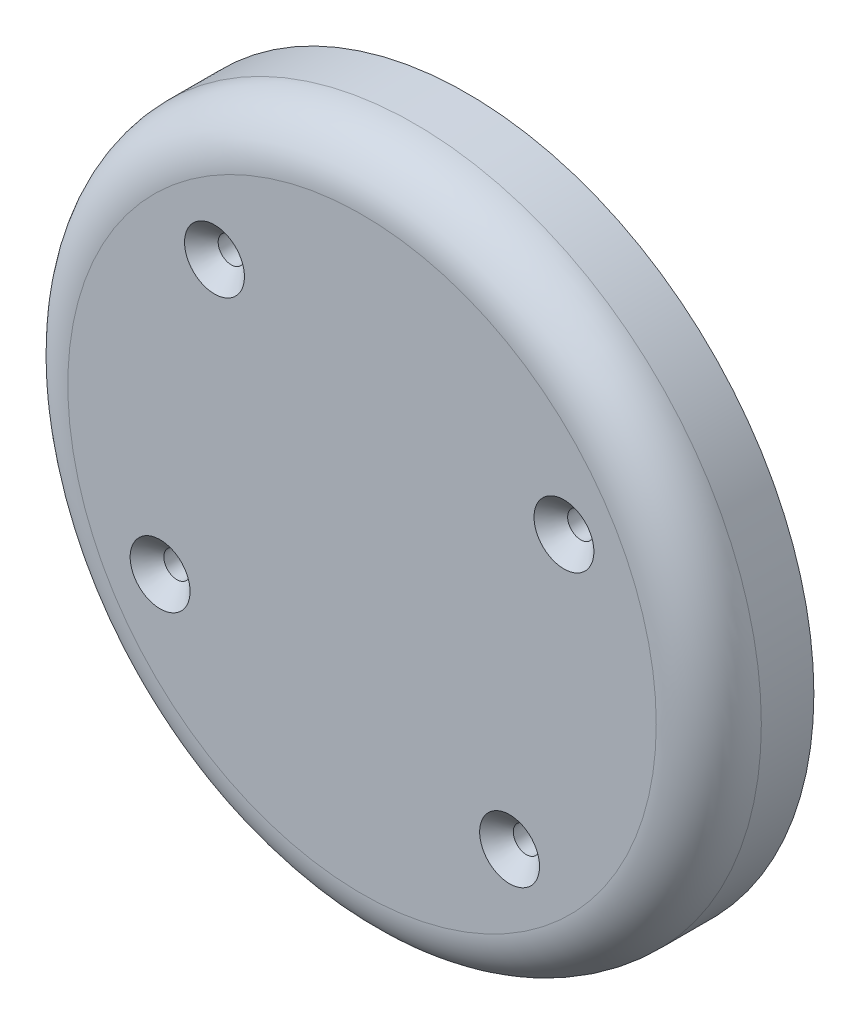
ISO-10303-21;
HEADER;
FILE_DESCRIPTION(('STEP AP214'),'2;1');
FILE_NAME('part.step','',(''),(''),'','','');
FILE_SCHEMA(('AUTOMOTIVE_DESIGN { 1 0 10303 214 1 1 1 1 }'));
ENDSEC;
DATA;
#1=APPLICATION_CONTEXT('core data for automotive mechanical design processes');
#2=APPLICATION_PROTOCOL_DEFINITION('international standard','automotive_design',2000,#1);
#3=PRODUCT_CONTEXT('',#1,'mechanical');
#4=PRODUCT('Part','Part','',(#3));
#5=PRODUCT_RELATED_PRODUCT_CATEGORY('part','',(#4));
#6=PRODUCT_DEFINITION_FORMATION('','',#4);
#7=PRODUCT_DEFINITION_CONTEXT('part definition',#1,'design');
#8=PRODUCT_DEFINITION('design','',#6,#7);
#9=PRODUCT_DEFINITION_SHAPE('','',#8);
#10=(LENGTH_UNIT() NAMED_UNIT(*) SI_UNIT(.MILLI.,.METRE.));
#11=(NAMED_UNIT(*) PLANE_ANGLE_UNIT() SI_UNIT($,.RADIAN.));
#12=(NAMED_UNIT(*) SI_UNIT($,.STERADIAN.) SOLID_ANGLE_UNIT());
#13=UNCERTAINTY_MEASURE_WITH_UNIT(LENGTH_MEASURE(1.E-05),#10,'distance_accuracy_value','');
#14=(GEOMETRIC_REPRESENTATION_CONTEXT(3) GLOBAL_UNCERTAINTY_ASSIGNED_CONTEXT((#13)) GLOBAL_UNIT_ASSIGNED_CONTEXT((#10,
#11,#12)) REPRESENTATION_CONTEXT('',''));
#15=CARTESIAN_POINT('',(0.,0.,0.));
#16=DIRECTION('',(0.,0.,1.));
#17=DIRECTION('',(1.,0.,0.));
#18=AXIS2_PLACEMENT_3D('',#15,#16,#17);
#19=CARTESIAN_POINT('',(0.,0.,10.));
#20=DIRECTION('',(0.,0.,-1.));
#21=DIRECTION('',(-1.,0.,0.));
#22=AXIS2_PLACEMENT_3D('',#19,#20,#21);
#23=CYLINDRICAL_SURFACE('',#22,33.);
#24=CARTESIAN_POINT('',(0.,0.,5.));
#25=DIRECTION('',(0.,0.,1.));
#26=DIRECTION('',(1.,0.,0.));
#27=AXIS2_PLACEMENT_3D('',#24,#25,#26);
#28=CIRCLE('',#27,33.);
#29=CARTESIAN_POINT('',(33.,0.,5.));
#30=VERTEX_POINT('',#29);
#31=EDGE_CURVE('E85',#30,#30,#28,.F.);
#32=ORIENTED_EDGE('',*,*,#31,.T.);
#33=EDGE_LOOP('',(#32));
#34=FACE_BOUND('',#33,.T.);
#35=CARTESIAN_POINT('',(0.,0.,0.));
#36=DIRECTION('',(0.,0.,1.));
#37=DIRECTION('',(1.,0.,0.));
#38=AXIS2_PLACEMENT_3D('',#35,#36,#37);
#39=CIRCLE('',#38,33.);
#40=CARTESIAN_POINT('',(33.,0.,0.));
#41=VERTEX_POINT('',#40);
#42=EDGE_CURVE('E101',#41,#41,#39,.T.);
#43=ORIENTED_EDGE('',*,*,#42,.T.);
#44=EDGE_LOOP('',(#43));
#45=FACE_BOUND('',#44,.T.);
#46=ADVANCED_FACE('F44',(#34,#45),#23,.T.);
#47=CARTESIAN_POINT('',(0.,0.,10.));
#48=DIRECTION('',(0.,0.,1.));
#49=DIRECTION('',(1.,0.,0.));
#50=AXIS2_PLACEMENT_3D('',#47,#48,#49);
#51=PLANE('',#50);
#52=CARTESIAN_POINT('',(14.0418239274444,-17.2825686976982,10.));
#53=DIRECTION('',(0.,0.,1.));
#54=DIRECTION('',(1.,0.,0.));
#55=AXIS2_PLACEMENT_3D('',#52,#53,#54);
#56=CIRCLE('',#55,2.85000000000001);
#57=CARTESIAN_POINT('',(16.8918239274444,-17.2825686976982,10.));
#58=VERTEX_POINT('',#57);
#59=EDGE_CURVE('E63',#58,#58,#56,.F.);
#60=ORIENTED_EDGE('',*,*,#59,.T.);
#61=EDGE_LOOP('',(#60));
#62=FACE_BOUND('',#61,.T.);
#63=CARTESIAN_POINT('',(-19.21586490121,-11.2521347351714,10.));
#64=DIRECTION('',(0.,0.,1.));
#65=DIRECTION('',(1.,0.,0.));
#66=AXIS2_PLACEMENT_3D('',#63,#64,#65);
#67=CIRCLE('',#66,2.85000000000001);
#68=CARTESIAN_POINT('',(-16.36586490121,-11.2521347351714,10.));
#69=VERTEX_POINT('',#68);
#70=EDGE_CURVE('E69',#69,#69,#67,.F.);
#71=ORIENTED_EDGE('',*,*,#70,.T.);
#72=EDGE_LOOP('',(#71));
#73=FACE_BOUND('',#72,.T.);
#74=CARTESIAN_POINT('',(-14.0418239274444,17.2825686976978,10.));
#75=DIRECTION('',(0.,0.,1.));
#76=DIRECTION('',(1.,0.,0.));
#77=AXIS2_PLACEMENT_3D('',#74,#75,#76);
#78=CIRCLE('',#77,2.85000000000001);
#79=CARTESIAN_POINT('',(-11.1918239274444,17.2825686976978,10.));
#80=VERTEX_POINT('',#79);
#81=EDGE_CURVE('E73',#80,#80,#78,.F.);
#82=ORIENTED_EDGE('',*,*,#81,.T.);
#83=EDGE_LOOP('',(#82));
#84=FACE_BOUND('',#83,.T.);
#85=CARTESIAN_POINT('',(19.21586490121,11.252134735171,10.));
#86=DIRECTION('',(0.,0.,1.));
#87=DIRECTION('',(1.,0.,0.));
#88=AXIS2_PLACEMENT_3D('',#85,#86,#87);
#89=CIRCLE('',#88,2.85000000000001);
#90=CARTESIAN_POINT('',(22.06586490121,11.252134735171,10.));
#91=VERTEX_POINT('',#90);
#92=EDGE_CURVE('E77',#91,#91,#89,.F.);
#93=ORIENTED_EDGE('',*,*,#92,.T.);
#94=EDGE_LOOP('',(#93));
#95=FACE_BOUND('',#94,.T.);
#96=CARTESIAN_POINT('',(0.,0.,10.));
#97=DIRECTION('',(0.,0.,1.));
#98=DIRECTION('',(1.,0.,0.));
#99=AXIS2_PLACEMENT_3D('',#96,#97,#98);
#100=CIRCLE('',#99,28.);
#101=CARTESIAN_POINT('',(28.,0.,10.));
#102=VERTEX_POINT('',#101);
#103=EDGE_CURVE('E89',#102,#102,#100,.T.);
#104=ORIENTED_EDGE('',*,*,#103,.T.);
#105=EDGE_LOOP('',(#104));
#106=FACE_BOUND('',#105,.T.);
#107=ADVANCED_FACE('F156',(#62,#73,#84,#95,#106),#51,.T.);
#108=CARTESIAN_POINT('',(0.,0.,0.));
#109=DIRECTION('',(0.,0.,1.));
#110=DIRECTION('',(1.,0.,0.));
#111=AXIS2_PLACEMENT_3D('',#108,#109,#110);
#112=PLANE('',#111);
#113=CARTESIAN_POINT('',(0.,0.,0.));
#114=DIRECTION('',(0.,0.,1.));
#115=DIRECTION('',(1.,0.,0.));
#116=AXIS2_PLACEMENT_3D('',#113,#114,#115);
#117=CIRCLE('',#116,30.);
#118=CARTESIAN_POINT('',(30.,0.,0.));
#119=VERTEX_POINT('',#118);
#120=EDGE_CURVE('E105',#119,#119,#117,.T.);
#121=ORIENTED_EDGE('',*,*,#120,.T.);
#122=EDGE_LOOP('',(#121));
#123=FACE_BOUND('',#122,.T.);
#124=ORIENTED_EDGE('',*,*,#42,.F.);
#125=EDGE_LOOP('',(#124));
#126=FACE_BOUND('',#125,.T.);
#127=ADVANCED_FACE('F150',(#123,#126),#112,.F.);
#128=CARTESIAN_POINT('',(0.,0.,10.));
#129=DIRECTION('',(0.,0.,-1.));
#130=DIRECTION('',(-1.,0.,0.));
#131=AXIS2_PLACEMENT_3D('',#128,#129,#130);
#132=CYLINDRICAL_SURFACE('',#131,30.);
#133=CARTESIAN_POINT('',(0.,0.,2.));
#134=DIRECTION('',(0.,0.,1.));
#135=DIRECTION('',(1.,0.,0.));
#136=AXIS2_PLACEMENT_3D('',#133,#134,#135);
#137=CIRCLE('',#136,30.);
#138=CARTESIAN_POINT('',(30.,0.,2.));
#139=VERTEX_POINT('',#138);
#140=EDGE_CURVE('E97',#139,#139,#137,.T.);
#141=ORIENTED_EDGE('',*,*,#140,.T.);
#142=EDGE_LOOP('',(#141));
#143=FACE_BOUND('',#142,.T.);
#144=ORIENTED_EDGE('',*,*,#120,.F.);
#145=EDGE_LOOP('',(#144));
#146=FACE_BOUND('',#145,.T.);
#147=ADVANCED_FACE('F132',(#143,#146),#132,.F.);
#148=CARTESIAN_POINT('',(0.,0.,7.));
#149=DIRECTION('',(0.,0.,1.));
#150=DIRECTION('',(1.,0.,0.));
#151=AXIS2_PLACEMENT_3D('',#148,#149,#150);
#152=PLANE('',#151);
#153=CARTESIAN_POINT('',(14.0418239274444,-17.2825686976982,7.));
#154=DIRECTION('',(0.,0.,1.));
#155=DIRECTION('',(1.,0.,0.));
#156=AXIS2_PLACEMENT_3D('',#153,#154,#155);
#157=CIRCLE('',#156,1.25000000000001);
#158=CARTESIAN_POINT('',(15.2918239274444,-17.2825686976982,7.));
#159=VERTEX_POINT('',#158);
#160=EDGE_CURVE('E109',#159,#159,#157,.F.);
#161=ORIENTED_EDGE('',*,*,#160,.F.);
#162=EDGE_LOOP('',(#161));
#163=FACE_BOUND('',#162,.T.);
#164=CARTESIAN_POINT('',(19.21586490121,11.252134735171,7.));
#165=DIRECTION('',(0.,0.,1.));
#166=DIRECTION('',(1.,0.,0.));
#167=AXIS2_PLACEMENT_3D('',#164,#165,#166);
#168=CIRCLE('',#167,1.25);
#169=CARTESIAN_POINT('',(20.46586490121,11.252134735171,7.));
#170=VERTEX_POINT('',#169);
#171=EDGE_CURVE('E118',#170,#170,#168,.F.);
#172=ORIENTED_EDGE('',*,*,#171,.F.);
#173=EDGE_LOOP('',(#172));
#174=FACE_BOUND('',#173,.T.);
#175=CARTESIAN_POINT('',(-19.21586490121,-11.2521347351714,7.));
#176=DIRECTION('',(0.,0.,1.));
#177=DIRECTION('',(1.,0.,0.));
#178=AXIS2_PLACEMENT_3D('',#175,#176,#177);
#179=CIRCLE('',#178,1.25);
#180=CARTESIAN_POINT('',(-17.96586490121,-11.2521347351714,7.));
#181=VERTEX_POINT('',#180);
#182=EDGE_CURVE('E114',#181,#181,#179,.F.);
#183=ORIENTED_EDGE('',*,*,#182,.F.);
#184=EDGE_LOOP('',(#183));
#185=FACE_BOUND('',#184,.T.);
#186=CARTESIAN_POINT('',(-14.0418239274444,17.2825686976978,7.));
#187=DIRECTION('',(0.,0.,1.));
#188=DIRECTION('',(1.,0.,0.));
#189=AXIS2_PLACEMENT_3D('',#186,#187,#188);
#190=CIRCLE('',#189,1.25);
#191=CARTESIAN_POINT('',(-12.7918239274444,17.2825686976978,7.));
#192=VERTEX_POINT('',#191);
#193=EDGE_CURVE('E110',#192,#192,#190,.F.);
#194=ORIENTED_EDGE('',*,*,#193,.F.);
#195=EDGE_LOOP('',(#194));
#196=FACE_BOUND('',#195,.T.);
#197=CARTESIAN_POINT('',(0.,0.,7.));
#198=DIRECTION('',(0.,0.,1.));
#199=DIRECTION('',(1.,0.,0.));
#200=AXIS2_PLACEMENT_3D('',#197,#198,#199);
#201=CIRCLE('',#200,25.);
#202=CARTESIAN_POINT('',(25.,0.,7.));
#203=VERTEX_POINT('',#202);
#204=EDGE_CURVE('E93',#203,#203,#201,.F.);
#205=ORIENTED_EDGE('',*,*,#204,.T.);
#206=EDGE_LOOP('',(#205));
#207=FACE_BOUND('',#206,.T.);
#208=ADVANCED_FACE('F128',(#163,#174,#185,#196,#207),#152,.F.);
#209=CARTESIAN_POINT('',(0.,0.,2.));
#210=DIRECTION('',(0.,0.,1.));
#211=DIRECTION('',(1.,0.,0.));
#212=AXIS2_PLACEMENT_3D('',#209,#210,#211);
#213=TOROIDAL_SURFACE('',#212,25.,5.);
#214=ORIENTED_EDGE('',*,*,#204,.F.);
#215=EDGE_LOOP('',(#214));
#216=FACE_BOUND('',#215,.T.);
#217=ORIENTED_EDGE('',*,*,#140,.F.);
#218=EDGE_LOOP('',(#217));
#219=FACE_BOUND('',#218,.T.);
#220=ADVANCED_FACE('F131',(#216,#219),#213,.F.);
#221=CARTESIAN_POINT('',(0.,0.,5.));
#222=DIRECTION('',(0.,0.,1.));
#223=DIRECTION('',(1.,0.,0.));
#224=AXIS2_PLACEMENT_3D('',#221,#222,#223);
#225=TOROIDAL_SURFACE('',#224,28.,5.);
#226=ORIENTED_EDGE('',*,*,#31,.F.);
#227=EDGE_LOOP('',(#226));
#228=FACE_BOUND('',#227,.T.);
#229=ORIENTED_EDGE('',*,*,#103,.F.);
#230=EDGE_LOOP('',(#229));
#231=FACE_BOUND('',#230,.T.);
#232=ADVANCED_FACE('F144',(#228,#231),#225,.T.);
#233=CARTESIAN_POINT('',(-14.0418239274444,17.2825686976978,-0.000999999999999265));
#234=DIRECTION('',(0.,0.,1.));
#235=DIRECTION('',(1.,0.,0.));
#236=AXIS2_PLACEMENT_3D('',#233,#234,#235);
#237=CYLINDRICAL_SURFACE('',#236,1.25);
#238=CARTESIAN_POINT('',(-14.0418239274444,17.2825686976978,8.4));
#239=DIRECTION('',(0.,0.,1.));
#240=DIRECTION('',(1.,0.,0.));
#241=AXIS2_PLACEMENT_3D('',#238,#239,#240);
#242=CIRCLE('',#241,1.25);
#243=CARTESIAN_POINT('',(-12.7918239274444,17.2825686976978,8.4));
#244=VERTEX_POINT('',#243);
#245=EDGE_CURVE('E53',#244,#244,#242,.T.);
#246=ORIENTED_EDGE('',*,*,#245,.T.);
#247=EDGE_LOOP('',(#246));
#248=FACE_BOUND('',#247,.T.);
#249=ORIENTED_EDGE('',*,*,#193,.T.);
#250=EDGE_LOOP('',(#249));
#251=FACE_BOUND('',#250,.T.);
#252=ADVANCED_FACE('F171',(#248,#251),#237,.F.);
#253=CARTESIAN_POINT('',(-19.21586490121,-11.2521347351714,-0.000999999999999265));
#254=DIRECTION('',(0.,0.,1.));
#255=DIRECTION('',(1.,0.,0.));
#256=AXIS2_PLACEMENT_3D('',#253,#254,#255);
#257=CYLINDRICAL_SURFACE('',#256,1.25);
#258=CARTESIAN_POINT('',(-19.21586490121,-11.2521347351714,8.4));
#259=DIRECTION('',(0.,0.,1.));
#260=DIRECTION('',(1.,0.,0.));
#261=AXIS2_PLACEMENT_3D('',#258,#259,#260);
#262=CIRCLE('',#261,1.25);
#263=CARTESIAN_POINT('',(-17.96586490121,-11.2521347351714,8.4));
#264=VERTEX_POINT('',#263);
#265=EDGE_CURVE('E58',#264,#264,#262,.T.);
#266=ORIENTED_EDGE('',*,*,#265,.T.);
#267=EDGE_LOOP('',(#266));
#268=FACE_BOUND('',#267,.T.);
#269=ORIENTED_EDGE('',*,*,#182,.T.);
#270=EDGE_LOOP('',(#269));
#271=FACE_BOUND('',#270,.T.);
#272=ADVANCED_FACE('F243',(#268,#271),#257,.F.);
#273=CARTESIAN_POINT('',(19.21586490121,11.252134735171,-0.000999999999999265));
#274=DIRECTION('',(0.,0.,1.));
#275=DIRECTION('',(1.,0.,0.));
#276=AXIS2_PLACEMENT_3D('',#273,#274,#275);
#277=CYLINDRICAL_SURFACE('',#276,1.25);
#278=CARTESIAN_POINT('',(19.21586490121,11.252134735171,8.40000000000001));
#279=DIRECTION('',(0.,0.,1.));
#280=DIRECTION('',(1.,0.,0.));
#281=AXIS2_PLACEMENT_3D('',#278,#279,#280);
#282=CIRCLE('',#281,1.25);
#283=CARTESIAN_POINT('',(20.46586490121,11.252134735171,8.4));
#284=VERTEX_POINT('',#283);
#285=EDGE_CURVE('E10',#284,#284,#282,.T.);
#286=ORIENTED_EDGE('',*,*,#285,.T.);
#287=EDGE_LOOP('',(#286));
#288=FACE_BOUND('',#287,.T.);
#289=ORIENTED_EDGE('',*,*,#171,.T.);
#290=EDGE_LOOP('',(#289));
#291=FACE_BOUND('',#290,.T.);
#292=ADVANCED_FACE('F233',(#288,#291),#277,.F.);
#293=CARTESIAN_POINT('',(14.0418239274444,-17.2825686976982,-0.000999999999999265));
#294=DIRECTION('',(0.,0.,1.));
#295=DIRECTION('',(1.,0.,0.));
#296=AXIS2_PLACEMENT_3D('',#293,#294,#295);
#297=CYLINDRICAL_SURFACE('',#296,1.25000000000001);
#298=CARTESIAN_POINT('',(14.0418239274444,-17.2825686976982,8.40000000000001));
#299=DIRECTION('',(0.,0.,1.));
#300=DIRECTION('',(1.,0.,0.));
#301=AXIS2_PLACEMENT_3D('',#298,#299,#300);
#302=CIRCLE('',#301,1.25000000000001);
#303=CARTESIAN_POINT('',(15.2918239274444,-17.2825686976982,8.40000000000001));
#304=VERTEX_POINT('',#303);
#305=EDGE_CURVE('E81',#304,#304,#302,.T.);
#306=ORIENTED_EDGE('',*,*,#305,.T.);
#307=EDGE_LOOP('',(#306));
#308=FACE_BOUND('',#307,.T.);
#309=ORIENTED_EDGE('',*,*,#160,.T.);
#310=EDGE_LOOP('',(#309));
#311=FACE_BOUND('',#310,.T.);
#312=ADVANCED_FACE('F126',(#308,#311),#297,.F.);
#313=CARTESIAN_POINT('',(14.0418239274444,-17.2825686976982,8.40000000000001));
#314=DIRECTION('',(0.,0.,1.));
#315=DIRECTION('',(1.,0.,0.));
#316=AXIS2_PLACEMENT_3D('',#313,#314,#315);
#317=CONICAL_SURFACE('',#316,1.25000000000001,0.785398163397452);
#318=ORIENTED_EDGE('',*,*,#59,.F.);
#319=EDGE_LOOP('',(#318));
#320=FACE_BOUND('',#319,.T.);
#321=ORIENTED_EDGE('',*,*,#305,.F.);
#322=EDGE_LOOP('',(#321));
#323=FACE_BOUND('',#322,.T.);
#324=ADVANCED_FACE('F174',(#320,#323),#317,.F.);
#325=CARTESIAN_POINT('',(-19.21586490121,-11.2521347351714,8.4));
#326=DIRECTION('',(0.,0.,1.));
#327=DIRECTION('',(1.,0.,0.));
#328=AXIS2_PLACEMENT_3D('',#325,#326,#327);
#329=CONICAL_SURFACE('',#328,1.25,0.785398163397452);
#330=CARTESIAN_POINT('',(-16.36586490121,-11.2521347351714,10.));
#331=CARTESIAN_POINT('',(-16.3825315678766,-11.2521347351714,9.98333333333334));
#332=CARTESIAN_POINT('',(-16.3991982345433,-11.2521347351714,9.96666666666667));
#333=CARTESIAN_POINT('',(-16.4325315678766,-11.2521347351714,9.93333333333333));
#334=CARTESIAN_POINT('',(-16.4491982345433,-11.2521347351714,9.91666666666667));
#335=CARTESIAN_POINT('',(-16.4825315678766,-11.2521347351714,9.88333333333333));
#336=CARTESIAN_POINT('',(-16.4991982345433,-11.2521347351714,9.86666666666667));
#337=CARTESIAN_POINT('',(-16.5325315678766,-11.2521347351714,9.83333333333333));
#338=CARTESIAN_POINT('',(-16.5491982345433,-11.2521347351714,9.81666666666667));
#339=CARTESIAN_POINT('',(-16.5825315678766,-11.2521347351714,9.78333333333333));
#340=CARTESIAN_POINT('',(-16.5991982345433,-11.2521347351714,9.76666666666667));
#341=CARTESIAN_POINT('',(-16.6325315678766,-11.2521347351714,9.73333333333333));
#342=CARTESIAN_POINT('',(-16.6491982345433,-11.2521347351714,9.71666666666667));
#343=CARTESIAN_POINT('',(-16.6825315678766,-11.2521347351714,9.68333333333333));
#344=CARTESIAN_POINT('',(-16.6991982345433,-11.2521347351714,9.66666666666667));
#345=CARTESIAN_POINT('',(-16.7325315678766,-11.2521347351714,9.63333333333333));
#346=CARTESIAN_POINT('',(-16.7491982345433,-11.2521347351714,9.61666666666667));
#347=CARTESIAN_POINT('',(-16.7825315678766,-11.2521347351714,9.58333333333333));
#348=CARTESIAN_POINT('',(-16.7991982345433,-11.2521347351714,9.56666666666667));
#349=CARTESIAN_POINT('',(-16.8325315678766,-11.2521347351714,9.53333333333333));
#350=CARTESIAN_POINT('',(-16.8491982345433,-11.2521347351714,9.51666666666667));
#351=CARTESIAN_POINT('',(-16.8825315678766,-11.2521347351714,9.48333333333333));
#352=CARTESIAN_POINT('',(-16.8991982345433,-11.2521347351714,9.46666666666667));
#353=CARTESIAN_POINT('',(-16.9325315678766,-11.2521347351714,9.43333333333333));
#354=CARTESIAN_POINT('',(-16.9491982345433,-11.2521347351714,9.41666666666667));
#355=CARTESIAN_POINT('',(-16.9825315678766,-11.2521347351714,9.38333333333333));
#356=CARTESIAN_POINT('',(-16.9991982345433,-11.2521347351714,9.36666666666667));
#357=CARTESIAN_POINT('',(-17.0325315678766,-11.2521347351714,9.33333333333333));
#358=CARTESIAN_POINT('',(-17.0491982345433,-11.2521347351714,9.31666666666667));
#359=CARTESIAN_POINT('',(-17.0825315678766,-11.2521347351714,9.28333333333333));
#360=CARTESIAN_POINT('',(-17.0991982345433,-11.2521347351714,9.26666666666667));
#361=CARTESIAN_POINT('',(-17.1325315678766,-11.2521347351714,9.23333333333333));
#362=CARTESIAN_POINT('',(-17.1491982345433,-11.2521347351714,9.21666666666667));
#363=CARTESIAN_POINT('',(-17.1825315678766,-11.2521347351714,9.18333333333334));
#364=CARTESIAN_POINT('',(-17.1991982345433,-11.2521347351714,9.16666666666667));
#365=CARTESIAN_POINT('',(-17.2325315678766,-11.2521347351714,9.13333333333333));
#366=CARTESIAN_POINT('',(-17.2491982345433,-11.2521347351714,9.11666666666667));
#367=CARTESIAN_POINT('',(-17.2825315678766,-11.2521347351714,9.08333333333333));
#368=CARTESIAN_POINT('',(-17.2991982345433,-11.2521347351714,9.06666666666667));
#369=CARTESIAN_POINT('',(-17.3325315678766,-11.2521347351714,9.03333333333333));
#370=CARTESIAN_POINT('',(-17.3491982345433,-11.2521347351714,9.01666666666667));
#371=CARTESIAN_POINT('',(-17.3825315678766,-11.2521347351714,8.98333333333333));
#372=CARTESIAN_POINT('',(-17.3991982345433,-11.2521347351714,8.96666666666667));
#373=CARTESIAN_POINT('',(-17.4325315678766,-11.2521347351714,8.93333333333334));
#374=CARTESIAN_POINT('',(-17.4491982345433,-11.2521347351714,8.91666666666667));
#375=CARTESIAN_POINT('',(-17.4825315678766,-11.2521347351714,8.88333333333333));
#376=CARTESIAN_POINT('',(-17.4991982345433,-11.2521347351714,8.86666666666667));
#377=CARTESIAN_POINT('',(-17.5325315678766,-11.2521347351714,8.83333333333334));
#378=CARTESIAN_POINT('',(-17.5491982345433,-11.2521347351714,8.81666666666667));
#379=CARTESIAN_POINT('',(-17.5825315678766,-11.2521347351714,8.78333333333333));
#380=CARTESIAN_POINT('',(-17.5991982345433,-11.2521347351714,8.76666666666667));
#381=CARTESIAN_POINT('',(-17.6325315678766,-11.2521347351714,8.73333333333333));
#382=CARTESIAN_POINT('',(-17.6491982345433,-11.2521347351714,8.71666666666667));
#383=CARTESIAN_POINT('',(-17.6825315678766,-11.2521347351714,8.68333333333334));
#384=CARTESIAN_POINT('',(-17.6991982345433,-11.2521347351714,8.66666666666667));
#385=CARTESIAN_POINT('',(-17.7325315678766,-11.2521347351714,8.63333333333333));
#386=CARTESIAN_POINT('',(-17.7491982345433,-11.2521347351714,8.61666666666667));
#387=CARTESIAN_POINT('',(-17.7825315678766,-11.2521347351714,8.58333333333334));
#388=CARTESIAN_POINT('',(-17.7991982345433,-11.2521347351714,8.56666666666667));
#389=CARTESIAN_POINT('',(-17.8325315678766,-11.2521347351714,8.53333333333333));
#390=CARTESIAN_POINT('',(-17.8491982345433,-11.2521347351714,8.51666666666667));
#391=CARTESIAN_POINT('',(-17.8825315678766,-11.2521347351714,8.48333333333334));
#392=CARTESIAN_POINT('',(-17.8991982345433,-11.2521347351714,8.46666666666667));
#393=CARTESIAN_POINT('',(-17.9325315678766,-11.2521347351714,8.43333333333334));
#394=CARTESIAN_POINT('',(-17.9491982345433,-11.2521347351714,8.41666666666667));
#395=CARTESIAN_POINT('',(-17.96586490121,-11.2521347351714,8.4));
#396=B_SPLINE_CURVE_WITH_KNOTS('',3,(#330,#331,#332,#333,#334,#335,#336,#337,#338,#339,#340,
#341,#342,#343,#344,#345,#346,#347,#348,#349,#350,#351,#352,#353,#354,#355,#356,#357,#358,#359,
#360,#361,#362,#363,#364,#365,#366,#367,#368,#369,#370,#371,#372,#373,#374,#375,#376,#377,#378,
#379,#380,#381,#382,#383,#384,#385,#386,#387,#388,#389,#390,#391,#392,#393,#394,#395),
.UNSPECIFIED.,.F.,.F.,(4,2,2,2,2,2,2,2,2,2,2,2,2,2,2,2,2,2,2,2,2,2,2,2,2,2,2,2,2,2,2,2,4),(0.,
0.0707106781186556,0.14142135623731,0.212132034355965,0.282842712474621,0.353553390593277,
0.42426406871193,0.494974746830585,0.565685424949238,0.636396103067895,0.707106781186551,
0.777817459305206,0.848528137423859,0.919238815542515,0.989949493661168,1.06066017177982,
1.13137084989848,1.20208152801713,1.27279220613579,1.34350288425444,1.4142135623731,
1.48492424049175,1.55563491861041,1.62634559672906,1.69705627484772,1.76776695296637,
1.83847763108503,1.90918830920368,1.97989898732234,2.05060966544099,2.12132034355965,
2.1920310216783,2.26274169979696),.UNSPECIFIED.);
#397=EDGE_CURVE('BSEAM180',#69,#264,#396,.T.);
#398=ORIENTED_EDGE('',*,*,#70,.F.);
#399=ORIENTED_EDGE('',*,*,#265,.F.);
#400=ORIENTED_EDGE('',*,*,#397,.T.);
#401=ORIENTED_EDGE('',*,*,#397,.F.);
#402=EDGE_LOOP('',(#398,#400,#399,#401));
#403=FACE_BOUND('',#402,.T.);
#404=ADVANCED_FACE('F180',(#403),#329,.F.);
#405=CARTESIAN_POINT('',(-14.0418239274444,17.2825686976978,8.4));
#406=DIRECTION('',(0.,0.,1.));
#407=DIRECTION('',(1.,0.,0.));
#408=AXIS2_PLACEMENT_3D('',#405,#406,#407);
#409=CONICAL_SURFACE('',#408,1.25,0.785398163397451);
#410=ORIENTED_EDGE('',*,*,#81,.F.);
#411=EDGE_LOOP('',(#410));
#412=FACE_BOUND('',#411,.T.);
#413=ORIENTED_EDGE('',*,*,#245,.F.);
#414=EDGE_LOOP('',(#413));
#415=FACE_BOUND('',#414,.T.);
#416=ADVANCED_FACE('F186',(#412,#415),#409,.F.);
#417=CARTESIAN_POINT('',(19.21586490121,11.252134735171,8.40000000000001));
#418=DIRECTION('',(0.,0.,1.));
#419=DIRECTION('',(1.,0.,0.));
#420=AXIS2_PLACEMENT_3D('',#417,#418,#419);
#421=CONICAL_SURFACE('',#420,1.25,0.785398163397452);
#422=CARTESIAN_POINT('',(22.06586490121,11.252134735171,10.));
#423=CARTESIAN_POINT('',(22.0491982345434,11.252134735171,9.98333333333334));
#424=CARTESIAN_POINT('',(22.0325315678767,11.252134735171,9.96666666666667));
#425=CARTESIAN_POINT('',(21.9991982345434,11.252134735171,9.93333333333333));
#426=CARTESIAN_POINT('',(21.9825315678767,11.252134735171,9.91666666666667));
#427=CARTESIAN_POINT('',(21.9491982345434,11.252134735171,9.88333333333333));
#428=CARTESIAN_POINT('',(21.9325315678767,11.252134735171,9.86666666666667));
#429=CARTESIAN_POINT('',(21.8991982345434,11.252134735171,9.83333333333333));
#430=CARTESIAN_POINT('',(21.8825315678767,11.252134735171,9.81666666666667));
#431=CARTESIAN_POINT('',(21.8491982345434,11.252134735171,9.78333333333333));
#432=CARTESIAN_POINT('',(21.8325315678767,11.252134735171,9.76666666666667));
#433=CARTESIAN_POINT('',(21.7991982345434,11.252134735171,9.73333333333333));
#434=CARTESIAN_POINT('',(21.7825315678767,11.252134735171,9.71666666666667));
#435=CARTESIAN_POINT('',(21.7491982345434,11.252134735171,9.68333333333333));
#436=CARTESIAN_POINT('',(21.7325315678767,11.252134735171,9.66666666666667));
#437=CARTESIAN_POINT('',(21.6991982345434,11.252134735171,9.63333333333333));
#438=CARTESIAN_POINT('',(21.6825315678767,11.252134735171,9.61666666666667));
#439=CARTESIAN_POINT('',(21.6491982345434,11.252134735171,9.58333333333333));
#440=CARTESIAN_POINT('',(21.6325315678767,11.252134735171,9.56666666666667));
#441=CARTESIAN_POINT('',(21.5991982345434,11.252134735171,9.53333333333333));
#442=CARTESIAN_POINT('',(21.5825315678767,11.252134735171,9.51666666666667));
#443=CARTESIAN_POINT('',(21.5491982345434,11.252134735171,9.48333333333333));
#444=CARTESIAN_POINT('',(21.5325315678767,11.252134735171,9.46666666666667));
#445=CARTESIAN_POINT('',(21.4991982345434,11.252134735171,9.43333333333334));
#446=CARTESIAN_POINT('',(21.4825315678767,11.252134735171,9.41666666666667));
#447=CARTESIAN_POINT('',(21.4491982345434,11.252134735171,9.38333333333334));
#448=CARTESIAN_POINT('',(21.4325315678767,11.252134735171,9.36666666666667));
#449=CARTESIAN_POINT('',(21.3991982345434,11.252134735171,9.33333333333334));
#450=CARTESIAN_POINT('',(21.3825315678767,11.252134735171,9.31666666666667));
#451=CARTESIAN_POINT('',(21.3491982345434,11.252134735171,9.28333333333334));
#452=CARTESIAN_POINT('',(21.3325315678767,11.252134735171,9.26666666666667));
#453=CARTESIAN_POINT('',(21.2991982345434,11.252134735171,9.23333333333334));
#454=CARTESIAN_POINT('',(21.2825315678767,11.252134735171,9.21666666666667));
#455=CARTESIAN_POINT('',(21.2491982345434,11.252134735171,9.18333333333334));
#456=CARTESIAN_POINT('',(21.2325315678767,11.252134735171,9.16666666666667));
#457=CARTESIAN_POINT('',(21.1991982345434,11.252134735171,9.13333333333333));
#458=CARTESIAN_POINT('',(21.1825315678767,11.252134735171,9.11666666666667));
#459=CARTESIAN_POINT('',(21.1491982345434,11.252134735171,9.08333333333334));
#460=CARTESIAN_POINT('',(21.1325315678767,11.252134735171,9.06666666666667));
#461=CARTESIAN_POINT('',(21.0991982345434,11.252134735171,9.03333333333334));
#462=CARTESIAN_POINT('',(21.0825315678767,11.252134735171,9.01666666666667));
#463=CARTESIAN_POINT('',(21.0491982345434,11.252134735171,8.98333333333334));
#464=CARTESIAN_POINT('',(21.0325315678767,11.252134735171,8.96666666666667));
#465=CARTESIAN_POINT('',(20.9991982345434,11.252134735171,8.93333333333334));
#466=CARTESIAN_POINT('',(20.9825315678767,11.252134735171,8.91666666666667));
#467=CARTESIAN_POINT('',(20.9491982345434,11.252134735171,8.88333333333334));
#468=CARTESIAN_POINT('',(20.9325315678767,11.252134735171,8.86666666666667));
#469=CARTESIAN_POINT('',(20.8991982345434,11.252134735171,8.83333333333334));
#470=CARTESIAN_POINT('',(20.8825315678767,11.252134735171,8.81666666666667));
#471=CARTESIAN_POINT('',(20.8491982345434,11.252134735171,8.78333333333334));
#472=CARTESIAN_POINT('',(20.8325315678767,11.252134735171,8.76666666666667));
#473=CARTESIAN_POINT('',(20.7991982345434,11.252134735171,8.73333333333334));
#474=CARTESIAN_POINT('',(20.7825315678767,11.252134735171,8.71666666666667));
#475=CARTESIAN_POINT('',(20.7491982345434,11.252134735171,8.68333333333334));
#476=CARTESIAN_POINT('',(20.7325315678767,11.252134735171,8.66666666666667));
#477=CARTESIAN_POINT('',(20.6991982345434,11.252134735171,8.63333333333334));
#478=CARTESIAN_POINT('',(20.6825315678767,11.252134735171,8.61666666666667));
#479=CARTESIAN_POINT('',(20.6491982345434,11.252134735171,8.58333333333334));
#480=CARTESIAN_POINT('',(20.6325315678767,11.252134735171,8.56666666666667));
#481=CARTESIAN_POINT('',(20.5991982345434,11.252134735171,8.53333333333334));
#482=CARTESIAN_POINT('',(20.5825315678767,11.252134735171,8.51666666666667));
#483=CARTESIAN_POINT('',(20.5491982345434,11.252134735171,8.48333333333334));
#484=CARTESIAN_POINT('',(20.5325315678767,11.252134735171,8.46666666666667));
#485=CARTESIAN_POINT('',(20.4991982345434,11.252134735171,8.43333333333334));
#486=CARTESIAN_POINT('',(20.4825315678767,11.252134735171,8.41666666666667));
#487=CARTESIAN_POINT('',(20.46586490121,11.252134735171,8.40000000000001));
#488=B_SPLINE_CURVE_WITH_KNOTS('',3,(#422,#423,#424,#425,#426,#427,#428,#429,#430,#431,#432,
#433,#434,#435,#436,#437,#438,#439,#440,#441,#442,#443,#444,#445,#446,#447,#448,#449,#450,#451,
#452,#453,#454,#455,#456,#457,#458,#459,#460,#461,#462,#463,#464,#465,#466,#467,#468,#469,#470,
#471,#472,#473,#474,#475,#476,#477,#478,#479,#480,#481,#482,#483,#484,#485,#486,#487),
.UNSPECIFIED.,.F.,.F.,(4,2,2,2,2,2,2,2,2,2,2,2,2,2,2,2,2,2,2,2,2,2,2,2,2,2,2,2,2,2,2,2,4),(0.,
0.0707106781186556,0.14142135623731,0.212132034355965,0.282842712474621,0.353553390593274,
0.42426406871193,0.494974746830583,0.565685424949238,0.636396103067894,0.707106781186549,
0.777817459305203,0.848528137423858,0.919238815542511,0.989949493661167,1.06066017177982,
1.13137084989848,1.20208152801713,1.27279220613579,1.34350288425444,1.4142135623731,
1.48492424049175,1.5556349186104,1.62634559672906,1.69705627484771,1.76776695296637,
1.83847763108502,1.90918830920368,1.97989898732233,2.05060966544099,2.12132034355964,
2.1920310216783,2.26274169979695),.UNSPECIFIED.);
#489=EDGE_CURVE('BSEAM47',#91,#284,#488,.T.);
#490=ORIENTED_EDGE('',*,*,#92,.F.);
#491=ORIENTED_EDGE('',*,*,#285,.F.);
#492=ORIENTED_EDGE('',*,*,#489,.T.);
#493=ORIENTED_EDGE('',*,*,#489,.F.);
#494=EDGE_LOOP('',(#490,#492,#491,#493));
#495=FACE_BOUND('',#494,.T.);
#496=ADVANCED_FACE('F47',(#495),#421,.F.);
#497=CLOSED_SHELL('',(#46,#107,#127,#147,#208,#220,#232,#252,#272,#292,#312,#324,#404,#416,#496));
#498=MANIFOLD_SOLID_BREP('B2',#497);
#499=ADVANCED_BREP_SHAPE_REPRESENTATION('',(#18,#498),#14);
#500=SHAPE_DEFINITION_REPRESENTATION(#9,#499);
ENDSEC;
END-ISO-10303-21;
